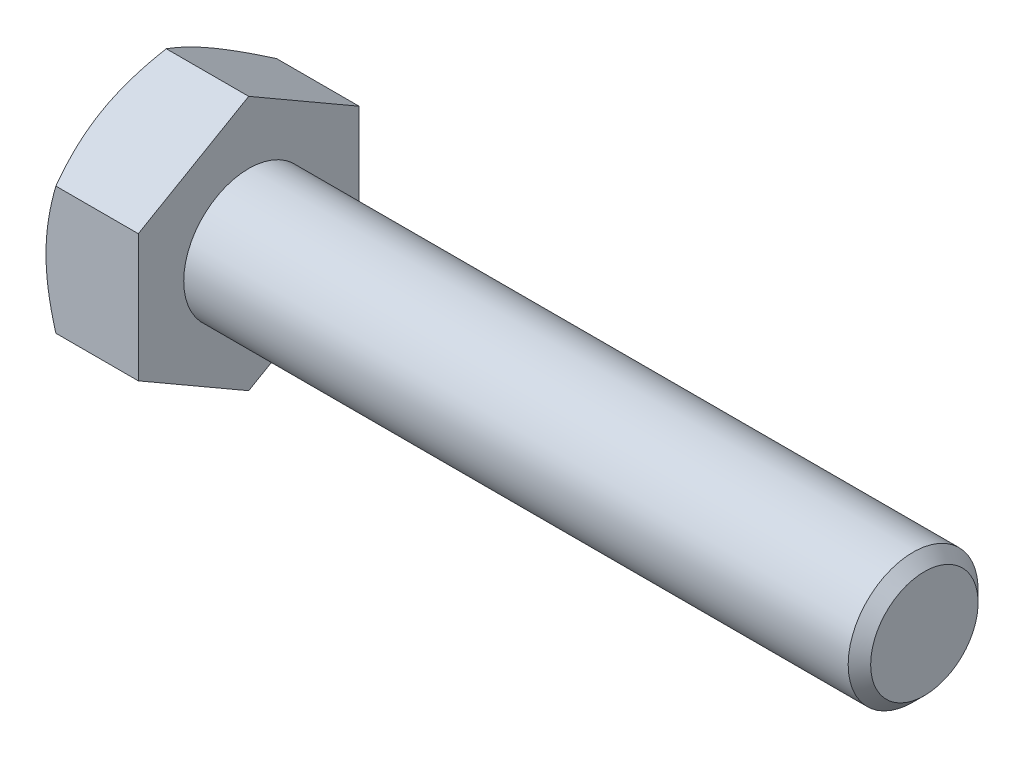
ISO-10303-21;
HEADER;
FILE_DESCRIPTION(('STEP AP214'),'2;1');
FILE_NAME('part.step','',(''),(''),'','','');
FILE_SCHEMA(('AUTOMOTIVE_DESIGN { 1 0 10303 214 1 1 1 1 }'));
ENDSEC;
DATA;
#1=APPLICATION_CONTEXT('core data for automotive mechanical design processes');
#2=APPLICATION_PROTOCOL_DEFINITION('international standard','automotive_design',2000,#1);
#3=PRODUCT_CONTEXT('',#1,'mechanical');
#4=PRODUCT('Part','Part','',(#3));
#5=PRODUCT_RELATED_PRODUCT_CATEGORY('part','',(#4));
#6=PRODUCT_DEFINITION_FORMATION('','',#4);
#7=PRODUCT_DEFINITION_CONTEXT('part definition',#1,'design');
#8=PRODUCT_DEFINITION('design','',#6,#7);
#9=PRODUCT_DEFINITION_SHAPE('','',#8);
#10=(LENGTH_UNIT() NAMED_UNIT(*) SI_UNIT(.MILLI.,.METRE.));
#11=(NAMED_UNIT(*) PLANE_ANGLE_UNIT() SI_UNIT($,.RADIAN.));
#12=(NAMED_UNIT(*) SI_UNIT($,.STERADIAN.) SOLID_ANGLE_UNIT());
#13=UNCERTAINTY_MEASURE_WITH_UNIT(LENGTH_MEASURE(1.E-05),#10,'distance_accuracy_value','');
#14=(GEOMETRIC_REPRESENTATION_CONTEXT(3) GLOBAL_UNCERTAINTY_ASSIGNED_CONTEXT((#13)) GLOBAL_UNIT_ASSIGNED_CONTEXT((#10,
#11,#12)) REPRESENTATION_CONTEXT('',''));
#15=CARTESIAN_POINT('',(0.,0.,0.));
#16=DIRECTION('',(0.,0.,1.));
#17=DIRECTION('',(1.,0.,0.));
#18=AXIS2_PLACEMENT_3D('',#15,#16,#17);
#19=CARTESIAN_POINT('',(11.2776,7.78695402066815,-13.4874));
#20=DIRECTION('',(0.,-0.866025403784438,0.500000000000001));
#21=DIRECTION('',(0.,-0.500000000000001,-0.866025403784438));
#22=AXIS2_PLACEMENT_3D('',#19,#20,#21);
#23=PLANE('',#22);
#24=CARTESIAN_POINT('',(1.20471264673993,15.5740235113902,0.000199999999999582));
#25=CARTESIAN_POINT('',(1.10590292123468,15.4028692246175,-0.296247920623444));
#26=CARTESIAN_POINT('',(1.01157697544227,15.2310473440943,-0.593852147541627));
#27=CARTESIAN_POINT('',(0.833138983730983,14.8860257724644,-1.19144703931188));
#28=CARTESIAN_POINT('',(0.749030297139716,14.7128256480417,-1.49143845468927));
#29=CARTESIAN_POINT('',(0.592157413557192,14.3647128557193,-2.09438749775631));
#30=CARTESIAN_POINT('',(0.51942005806566,14.1897971415685,-2.39735040170777));
#31=CARTESIAN_POINT('',(0.38685172011164,13.8387502572329,-3.00538144121574));
#32=CARTESIAN_POINT('',(0.327020001354858,13.6626191569806,-3.31044945564581));
#33=CARTESIAN_POINT('',(0.222807788341058,13.313654660846,-3.91487369298854));
#34=CARTESIAN_POINT('',(0.178082371198204,13.1408471725831,-4.21418504258819));
#35=CARTESIAN_POINT('',(0.103087648051446,12.794440353521,-4.81417925329214));
#36=CARTESIAN_POINT('',(0.0728186202980918,12.6208410075453,-5.11486214068277));
#37=CARTESIAN_POINT('',(0.0275009516884585,12.2733506882642,-5.71673302881592));
#38=CARTESIAN_POINT('',(0.0124342242129559,12.0994603086309,-6.0179200012882));
#39=CARTESIAN_POINT('',(-0.00215482226567055,11.7515190260032,-6.62057198085018));
#40=CARTESIAN_POINT('',(-0.00167762156738058,11.5774681281348,-6.9220369790612));
#41=CARTESIAN_POINT('',(0.0137354960980475,11.2520805117557,-7.48562486278348));
#42=CARTESIAN_POINT('',(0.0267913834058012,11.1007206061918,-7.74778790944904));
#43=CARTESIAN_POINT('',(0.0644123875667279,10.7983489571605,-8.27151096833966));
#44=CARTESIAN_POINT('',(0.0889783185108697,10.6473372390793,-8.53307093659454));
#45=CARTESIAN_POINT('',(0.149191083844901,10.3457439897813,-9.05544576759836));
#46=CARTESIAN_POINT('',(0.184847070217926,10.1951629179108,-9.31625983473626));
#47=CARTESIAN_POINT('',(0.266614364732165,9.89470672888655,-9.83666521957483));
#48=CARTESIAN_POINT('',(0.312726383654766,9.74483166043291,-10.0962564529244));
#49=CARTESIAN_POINT('',(0.467912143386673,9.2898775346353,-10.8842601139189));
#50=CARTESIAN_POINT('',(0.592459573008814,8.98611595538875,-11.4103906025613));
#51=CARTESIAN_POINT('',(0.875131353524433,8.38312227361395,-12.4548062960383));
#52=CARTESIAN_POINT('',(1.0331893172288,8.08388245064316,-12.9731048730716));
#53=CARTESIAN_POINT('',(1.20471264673992,7.78683855061431,-13.4876));
#54=B_SPLINE_CURVE_WITH_KNOTS('',3,(#24,#25,#26,#27,#28,#29,#30,#31,#32,#33,#34,#35,#36,#37,#38,
#39,#40,#41,#42,#43,#44,#45,#46,#47,#48,#49,#50,#51,#52,#53),.UNSPECIFIED.,.F.,.F.,(4,2,2,2,2,2,
2,2,2,2,2,2,2,2,4),(0.,1.06888094682568,2.13811238471378,3.20983077891486,4.28148801309774,
5.32669414783996,6.37192039946302,7.4159016434827,8.4598506291032,9.368635201441,
10.2774840606786,11.1870849394316,12.0967476696849,13.9560764321537,15.811755563385),.UNSPECIFIED.);
#55=CARTESIAN_POINT('',(1.20464597933184,15.5739080413363,0.));
#56=VERTEX_POINT('',#55);
#57=CARTESIAN_POINT('',(0.,11.6804310310022,-6.74370000000001));
#58=VERTEX_POINT('',#57);
#59=EDGE_CURVE('E53',#56,#58,#54,.T.);
#60=ORIENTED_EDGE('',*,*,#59,.F.);
#61=DIRECTION('',(-1.,0.,0.));
#62=VECTOR('',#61,1.);
#63=CARTESIAN_POINT('',(11.2776,15.5739080413363,0.));
#64=LINE('',#63,#62);
#65=CARTESIAN_POINT('',(11.2776,15.5739080413363,0.));
#66=VERTEX_POINT('',#65);
#67=EDGE_CURVE('E149',#66,#56,#64,.T.);
#68=ORIENTED_EDGE('',*,*,#67,.F.);
#69=DIRECTION('',(0.,0.500000000000001,0.866025403784438));
#70=VECTOR('',#69,1.);
#71=CARTESIAN_POINT('',(11.2776,7.78695402066815,-13.4874));
#72=LINE('',#71,#70);
#73=CARTESIAN_POINT('',(11.2776,7.78695402066815,-13.4874));
#74=VERTEX_POINT('',#73);
#75=EDGE_CURVE('E240',#74,#66,#72,.T.);
#76=ORIENTED_EDGE('',*,*,#75,.F.);
#77=DIRECTION('',(-1.,0.,0.));
#78=VECTOR('',#77,1.);
#79=CARTESIAN_POINT('',(11.2776,7.78695402066815,-13.4874));
#80=LINE('',#79,#78);
#81=CARTESIAN_POINT('',(1.20464597933183,7.78695402066815,-13.4874));
#82=VERTEX_POINT('',#81);
#83=EDGE_CURVE('E137',#74,#82,#80,.T.);
#84=ORIENTED_EDGE('',*,*,#83,.T.);
#85=EDGE_CURVE('E131',#58,#82,#54,.T.);
#86=ORIENTED_EDGE('',*,*,#85,.F.);
#87=EDGE_LOOP('',(#60,#68,#76,#84,#86));
#88=FACE_BOUND('',#87,.T.);
#89=ADVANCED_FACE('F37',(#88),#23,.F.);
#90=CARTESIAN_POINT('',(11.2776,15.5739080413363,0.));
#91=DIRECTION('',(0.,-0.866025403784438,-0.500000000000001));
#92=DIRECTION('',(0.,0.500000000000001,-0.866025403784438));
#93=AXIS2_PLACEMENT_3D('',#90,#91,#92);
#94=PLANE('',#93);
#95=CARTESIAN_POINT('',(1.20471264673993,7.78683855061431,13.4876));
#96=CARTESIAN_POINT('',(1.10590292123467,7.95799283738696,13.1911520793766));
#97=CARTESIAN_POINT('',(1.01157697544226,8.12981471791015,12.8935478524584));
#98=CARTESIAN_POINT('',(0.833138983730976,8.47483628954005,12.2959529606881));
#99=CARTESIAN_POINT('',(0.749030297139708,8.64803641396276,11.9959615453107));
#100=CARTESIAN_POINT('',(0.592157413557186,8.99614920628514,11.3930125022437));
#101=CARTESIAN_POINT('',(0.519420058065655,9.17106492043599,11.0900495982922));
#102=CARTESIAN_POINT('',(0.386851720111636,9.52211180477157,10.4820185587843));
#103=CARTESIAN_POINT('',(0.327020001354854,9.69824290502391,10.1769505443542));
#104=CARTESIAN_POINT('',(0.222807788341055,10.0472074011585,9.57252630701147));
#105=CARTESIAN_POINT('',(0.178082371198202,10.2200148894213,9.27321495741181));
#106=CARTESIAN_POINT('',(0.103087648051445,10.5664217084835,8.67322074670786));
#107=CARTESIAN_POINT('',(0.0728186202980906,10.7400210544592,8.37253785931723));
#108=CARTESIAN_POINT('',(0.0275009516884577,11.0875113737403,7.77066697118409));
#109=CARTESIAN_POINT('',(0.0124342242129552,11.2614017533735,7.4694799987118));
#110=CARTESIAN_POINT('',(-0.00215482226566931,11.6093430360013,6.86682801914982));
#111=CARTESIAN_POINT('',(-0.00167762156737742,11.7833939338697,6.5653630209388));
#112=CARTESIAN_POINT('',(0.0137354960980513,12.1087815502488,6.00177513721653));
#113=CARTESIAN_POINT('',(0.0267913834058043,12.2601414558127,5.73961209055097));
#114=CARTESIAN_POINT('',(0.0644123875667306,12.562513104844,5.21588903166034));
#115=CARTESIAN_POINT('',(0.0889783185108728,12.7135248229252,4.95432906340547));
#116=CARTESIAN_POINT('',(0.149191083844905,13.0151180722231,4.43195423240164));
#117=CARTESIAN_POINT('',(0.18484707021793,13.1656991440936,4.17114016526374));
#118=CARTESIAN_POINT('',(0.26661436473217,13.4661553331179,3.65073478042517));
#119=CARTESIAN_POINT('',(0.312726383654772,13.6160304015716,3.3911435470756));
#120=CARTESIAN_POINT('',(0.46791214338668,14.0709845273692,2.60313988608106));
#121=CARTESIAN_POINT('',(0.592459573008822,14.3747461066157,2.07700939743867));
#122=CARTESIAN_POINT('',(0.875131353524442,14.9777397883905,1.0325937039617));
#123=CARTESIAN_POINT('',(1.0331893172288,15.2769796113613,0.514295126928374));
#124=CARTESIAN_POINT('',(1.20471264673993,15.5740235113902,-0.000199999999999983));
#125=B_SPLINE_CURVE_WITH_KNOTS('',3,(#95,#96,#97,#98,#99,#100,#101,#102,#103,#104,#105,#106,
#107,#108,#109,#110,#111,#112,#113,#114,#115,#116,#117,#118,#119,#120,#121,#122,#123,#124),
.UNSPECIFIED.,.F.,.F.,(4,2,2,2,2,2,2,2,2,2,2,2,2,2,4),(0.,1.06888094682568,2.13811238471378,
3.20983077891486,4.28148801309774,5.32669414783995,6.37192039946301,7.41590164348269,
8.4598506291032,9.36863520144099,10.2774840606786,11.1870849394316,12.0967476696849,
13.9560764321537,15.811755563385),.UNSPECIFIED.);
#126=CARTESIAN_POINT('',(1.20464597933183,7.78695402066815,13.4874));
#127=VERTEX_POINT('',#126);
#128=CARTESIAN_POINT('',(0.,11.6804310310022,6.74370000000001));
#129=VERTEX_POINT('',#128);
#130=EDGE_CURVE('E60',#127,#129,#125,.T.);
#131=ORIENTED_EDGE('',*,*,#130,.F.);
#132=DIRECTION('',(-1.,0.,0.));
#133=VECTOR('',#132,1.);
#134=CARTESIAN_POINT('',(11.2776,7.78695402066815,13.4874));
#135=LINE('',#134,#133);
#136=CARTESIAN_POINT('',(11.2776,7.78695402066815,13.4874));
#137=VERTEX_POINT('',#136);
#138=EDGE_CURVE('E147',#137,#127,#135,.T.);
#139=ORIENTED_EDGE('',*,*,#138,.F.);
#140=DIRECTION('',(0.,-0.500000000000001,0.866025403784438));
#141=VECTOR('',#140,1.);
#142=CARTESIAN_POINT('',(11.2776,15.5739080413363,0.));
#143=LINE('',#142,#141);
#144=EDGE_CURVE('E238',#66,#137,#143,.T.);
#145=ORIENTED_EDGE('',*,*,#144,.F.);
#146=ORIENTED_EDGE('',*,*,#67,.T.);
#147=EDGE_CURVE('E164',#129,#56,#125,.T.);
#148=ORIENTED_EDGE('',*,*,#147,.F.);
#149=EDGE_LOOP('',(#131,#139,#145,#146,#148));
#150=FACE_BOUND('',#149,.T.);
#151=ADVANCED_FACE('F170',(#150),#94,.F.);
#152=CARTESIAN_POINT('',(11.2776,7.78695402066815,13.4874));
#153=DIRECTION('',(0.,0.,-1.));
#154=DIRECTION('',(-1.,0.,0.));
#155=AXIS2_PLACEMENT_3D('',#152,#153,#154);
#156=PLANE('',#155);
#157=CARTESIAN_POINT('',(6.70289567110901,-21.1650011460167,13.4874));
#158=CARTESIAN_POINT('',(6.55897882420083,-20.8694131098093,13.4874));
#159=CARTESIAN_POINT('',(6.41576105782704,-20.5734848616067,13.4874));
#160=CARTESIAN_POINT('',(6.13088153453249,-19.9808770343434,13.4874));
#161=CARTESIAN_POINT('',(5.98921979251738,-19.6841974481188,13.4874));
#162=CARTESIAN_POINT('',(5.56676961746989,-18.7928496773901,13.4874));
#163=CARTESIAN_POINT('',(5.28855708501329,-18.1969561570232,13.4874));
#164=CARTESIAN_POINT('',(4.73919155772155,-16.9981378757298,13.4874));
#165=CARTESIAN_POINT('',(4.46808314591332,-16.3951926367063,13.4874));
#166=CARTESIAN_POINT('',(3.9366293310848,-15.1845934749592,13.4874));
#167=CARTESIAN_POINT('',(3.67628343580331,-14.5769397691067,13.4874));
#168=CARTESIAN_POINT('',(3.16064854718106,-13.3353806523822,13.4874));
#169=CARTESIAN_POINT('',(2.90582565865237,-12.7012806750375,13.4874));
#170=CARTESIAN_POINT('',(2.41487039511458,-11.4257499308222,13.4874));
#171=CARTESIAN_POINT('',(2.17874008282491,-10.7843183638259,13.4874));
#172=CARTESIAN_POINT('',(1.73119169838206,-9.49424688182772,13.4874));
#173=CARTESIAN_POINT('',(1.51972566234566,-8.8456237373687,13.4874));
#174=CARTESIAN_POINT('',(1.12811373334564,-7.53901553680717,13.4874));
#175=CARTESIAN_POINT('',(0.947958233680589,-6.88103341949477,13.4874));
#176=CARTESIAN_POINT('',(0.708100926721024,-5.88874746863111,13.4874));
#177=CARTESIAN_POINT('',(0.633381885453708,-5.55805325553757,13.4874));
#178=CARTESIAN_POINT('',(0.494933342558831,-4.89436040722769,13.4874));
#179=CARTESIAN_POINT('',(0.431203627655067,-4.56136181686422,13.4874));
#180=CARTESIAN_POINT('',(0.315842689047359,-3.89327115028416,13.4874));
#181=CARTESIAN_POINT('',(0.264211246265808,-3.55817911208892,13.4874));
#182=CARTESIAN_POINT('',(0.174067184363883,-2.88623799123086,13.4874));
#183=CARTESIAN_POINT('',(0.135553978986036,-2.54938898777054,13.4874));
#184=CARTESIAN_POINT('',(0.0729081917491167,-1.8789079692466,13.4874));
#185=CARTESIAN_POINT('',(0.0485895630452332,-1.54529344529535,13.4874));
#186=CARTESIAN_POINT('',(0.0140936953875874,-0.877334753257613,13.4874));
#187=CARTESIAN_POINT('',(0.00391621478539878,-0.542990597737098,13.4874));
#188=CARTESIAN_POINT('',(-0.00205398162992253,0.125828888759139,13.4874));
#189=CARTESIAN_POINT('',(0.00215329089649117,0.460304219628309,13.4874));
#190=CARTESIAN_POINT('',(0.0248467834538898,1.12877320703551,13.4874));
#191=CARTESIAN_POINT('',(0.0433336380154095,1.462766841508,13.4874));
#192=CARTESIAN_POINT('',(0.103957920963044,2.25806301438129,13.4874));
#193=CARTESIAN_POINT('',(0.152459292642797,2.7188913808826,13.4874));
#194=CARTESIAN_POINT('',(0.274055458410876,3.63726733621982,13.4874));
#195=CARTESIAN_POINT('',(0.347153391946035,4.09481449863288,13.4874));
#196=CARTESIAN_POINT('',(0.599477852560546,5.46193438681152,13.4874));
#197=CARTESIAN_POINT('',(0.811693587459027,6.36550685182964,13.4874));
#198=CARTESIAN_POINT('',(1.18147428848563,7.7168988616068,13.4874));
#199=CARTESIAN_POINT('',(1.31507608235492,8.17168027844059,13.4874));
#200=CARTESIAN_POINT('',(1.5966046388761,9.07683098072689,13.4874));
#201=CARTESIAN_POINT('',(1.74453150078872,9.52720023558299,13.4874));
#202=CARTESIAN_POINT('',(2.05229982617036,10.4236592938426,13.4874));
#203=CARTESIAN_POINT('',(2.21213768863264,10.8697503449942,13.4874));
#204=CARTESIAN_POINT('',(2.54180286188869,11.7582069223146,13.4874));
#205=CARTESIAN_POINT('',(2.71163002533319,12.2005725033266,13.4874));
#206=CARTESIAN_POINT('',(3.13997482022977,13.2855075061871,13.4874));
#207=CARTESIAN_POINT('',(3.40323541651347,13.9262014359075,13.4874));
#208=CARTESIAN_POINT('',(3.94357290850478,15.2017556015035,13.4874));
#209=CARTESIAN_POINT('',(4.22065084854956,15.8366153921178,13.4874));
#210=CARTESIAN_POINT('',(4.78571477781993,17.1016560512798,13.4874));
#211=CARTESIAN_POINT('',(5.07370373250181,17.7318355913306,13.4874));
#212=CARTESIAN_POINT('',(5.6582709376612,18.9881665962922,13.4874));
#213=CARTESIAN_POINT('',(5.95484895914456,19.6143181680502,13.4874));
#214=CARTESIAN_POINT('',(6.55529098073026,20.8640886439908,13.4874));
#215=CARTESIAN_POINT('',(6.85916373799559,21.487703332918,13.4874));
#216=CARTESIAN_POINT('',(7.47253580273156,22.7321593932013,13.4874));
#217=CARTESIAN_POINT('',(7.78203514040859,23.3530007496463,13.4874));
#218=CARTESIAN_POINT('',(8.40560448696871,24.5922586187533,13.4874));
#219=CARTESIAN_POINT('',(8.71967376781928,25.2106754981538,13.4874));
#220=CARTESIAN_POINT('',(9.35165086063897,26.4455459003651,13.4874));
#221=CARTESIAN_POINT('',(9.66955868838178,27.0619994150947,13.4874));
#222=CARTESIAN_POINT('',(10.5703283480072,28.7975880261079,13.4874));
#223=CARTESIAN_POINT('',(11.1568860284919,29.9148048217173,13.4874));
#224=CARTESIAN_POINT('',(12.337846772962,32.1451360163921,13.4874));
#225=CARTESIAN_POINT('',(12.9322501754984,33.2582502357585,13.4874));
#226=CARTESIAN_POINT('',(14.1253307037013,35.4781426665254,13.4874));
#227=CARTESIAN_POINT('',(14.7239910663369,36.5849298934138,13.4874));
#228=CARTESIAN_POINT('',(15.625417956536,38.2431956931505,13.4874));
#229=CARTESIAN_POINT('',(15.9264569466041,38.795614729406,13.4874));
#230=CARTESIAN_POINT('',(16.5295640603066,39.8998897044512,13.4874));
#231=CARTESIAN_POINT('',(16.8316321823926,40.4517456440866,13.4874));
#232=CARTESIAN_POINT('',(17.1341541394821,41.0033527535217,13.4874));
#233=B_SPLINE_CURVE_WITH_KNOTS('',3,(#157,#158,#159,#160,#161,#162,#163,#164,#165,#166,#167,
#168,#169,#170,#171,#172,#173,#174,#175,#176,#177,#178,#179,#180,#181,#182,#183,#184,#185,#186,
#187,#188,#189,#190,#191,#192,#193,#194,#195,#196,#197,#198,#199,#200,#201,#202,#203,#204,#205,
#206,#207,#208,#209,#210,#211,#212,#213,#214,#215,#216,#217,#218,#219,#220,#221,#222,#223,#224,
#225,#226,#227,#228,#229,#230,#231,#232),.UNSPECIFIED.,.F.,.F.,(4,2,2,2,2,2,2,2,2,2,2,2,2,2,2,2,
2,2,2,2,2,2,2,2,2,2,2,2,2,2,2,2,2,2,2,2,2,4),(0.,0.986283805121444,1.97257704994349,
3.94544286935061,5.9286370113506,7.91174034446846,9.96167557472267,12.0118367002139,
14.0579420096359,16.103418420291,17.1203565303706,18.1372749019233,19.1541748575187,
20.1710293616237,21.1742380617423,22.1774296185014,23.1806203620616,24.1838556861831,
25.5731966840952,26.9627150815065,29.7431867200321,31.1650601311074,32.5869433952803,
34.0083985174925,35.4298326774873,37.5076242640023,39.5855731320869,41.6640908660621,
43.7425532353441,45.8236496276477,47.90475719566,49.9855367777957,52.0663249133592,
55.8517771330206,59.6373932363266,63.4123417474898,65.2996992534978,67.1870539207399),.UNSPECIFIED.);
#234=CARTESIAN_POINT('',(1.20464597933183,-7.78695402066814,13.4874));
#235=VERTEX_POINT('',#234);
#236=CARTESIAN_POINT('',(0.,0.,13.4874));
#237=VERTEX_POINT('',#236);
#238=EDGE_CURVE('E250',#235,#237,#233,.T.);
#239=ORIENTED_EDGE('',*,*,#238,.F.);
#240=DIRECTION('',(-1.,0.,0.));
#241=VECTOR('',#240,1.);
#242=CARTESIAN_POINT('',(11.2776,-7.78695402066814,13.4874));
#243=LINE('',#242,#241);
#244=CARTESIAN_POINT('',(11.2776,-7.78695402066814,13.4874));
#245=VERTEX_POINT('',#244);
#246=EDGE_CURVE('E139',#245,#235,#243,.T.);
#247=ORIENTED_EDGE('',*,*,#246,.F.);
#248=DIRECTION('',(0.,-1.,0.));
#249=VECTOR('',#248,1.);
#250=CARTESIAN_POINT('',(11.2776,7.78695402066815,13.4874));
#251=LINE('',#250,#249);
#252=EDGE_CURVE('E234',#137,#245,#251,.T.);
#253=ORIENTED_EDGE('',*,*,#252,.F.);
#254=ORIENTED_EDGE('',*,*,#138,.T.);
#255=EDGE_CURVE('E188',#237,#127,#233,.T.);
#256=ORIENTED_EDGE('',*,*,#255,.F.);
#257=EDGE_LOOP('',(#239,#247,#253,#254,#256));
#258=FACE_BOUND('',#257,.T.);
#259=ADVANCED_FACE('F256',(#258),#156,.F.);
#260=CARTESIAN_POINT('',(11.2776,-15.5739080413363,0.));
#261=DIRECTION('',(0.,0.866025403784438,-0.500000000000002));
#262=DIRECTION('',(0.,0.500000000000002,0.866025403784438));
#263=AXIS2_PLACEMENT_3D('',#260,#261,#262);
#264=PLANE('',#263);
#265=CARTESIAN_POINT('',(1.20471264673994,-15.5740235113902,-0.000200000000000067));
#266=CARTESIAN_POINT('',(1.10590292123468,-15.4028692246175,0.296247920623443));
#267=CARTESIAN_POINT('',(1.01157697544227,-15.2310473440943,0.593852147541626));
#268=CARTESIAN_POINT('',(0.833138983730989,-14.8860257724644,1.19144703931188));
#269=CARTESIAN_POINT('',(0.749030297139722,-14.7128256480417,1.49143845468927));
#270=CARTESIAN_POINT('',(0.592157413557198,-14.3647128557193,2.09438749775631));
#271=CARTESIAN_POINT('',(0.519420058065666,-14.1897971415685,2.39735040170777));
#272=CARTESIAN_POINT('',(0.386851720111645,-13.8387502572329,3.00538144121574));
#273=CARTESIAN_POINT('',(0.327020001354862,-13.6626191569806,3.31044945564582));
#274=CARTESIAN_POINT('',(0.222807788341062,-13.313654660846,3.91487369298854));
#275=CARTESIAN_POINT('',(0.178082371198208,-13.1408471725831,4.2141850425882));
#276=CARTESIAN_POINT('',(0.103087648051449,-12.794440353521,4.81417925329215));
#277=CARTESIAN_POINT('',(0.0728186202980949,-12.6208410075453,5.11486214068278));
#278=CARTESIAN_POINT('',(0.0275009516884614,-12.2733506882642,5.71673302881592));
#279=CARTESIAN_POINT('',(0.0124342242129589,-12.0994603086309,6.0179200012882));
#280=CARTESIAN_POINT('',(-0.00215482226566748,-11.7515190260032,6.62057198085018));
#281=CARTESIAN_POINT('',(-0.00167762156737732,-11.5774681281348,6.92203697906121));
#282=CARTESIAN_POINT('',(0.0137354960980507,-11.2520805117557,7.48562486278348));
#283=CARTESIAN_POINT('',(0.0267913834058044,-11.1007206061918,7.74778790944904));
#284=CARTESIAN_POINT('',(0.0644123875667303,-10.7983489571605,8.27151096833967));
#285=CARTESIAN_POINT('',(0.0889783185108715,-10.6473372390793,8.53307093659454));
#286=CARTESIAN_POINT('',(0.149191083844902,-10.3457439897813,9.05544576759836));
#287=CARTESIAN_POINT('',(0.184847070217927,-10.1951629179108,9.31625983473627));
#288=CARTESIAN_POINT('',(0.266614364732166,-9.89470672888655,9.83666521957483));
#289=CARTESIAN_POINT('',(0.312726383654767,-9.74483166043291,10.0962564529244));
#290=CARTESIAN_POINT('',(0.467912143386673,-9.2898775346353,10.8842601139189));
#291=CARTESIAN_POINT('',(0.592459573008814,-8.98611595538874,11.4103906025613));
#292=CARTESIAN_POINT('',(0.875131353524433,-8.38312227361395,12.4548062960383));
#293=CARTESIAN_POINT('',(1.0331893172288,-8.08388245064316,12.9731048730716));
#294=CARTESIAN_POINT('',(1.20471264673992,-7.7868385506143,13.4876));
#295=B_SPLINE_CURVE_WITH_KNOTS('',3,(#265,#266,#267,#268,#269,#270,#271,#272,#273,#274,#275,
#276,#277,#278,#279,#280,#281,#282,#283,#284,#285,#286,#287,#288,#289,#290,#291,#292,#293,#294),
.UNSPECIFIED.,.F.,.F.,(4,2,2,2,2,2,2,2,2,2,2,2,2,2,4),(0.,1.06888094682568,2.13811238471378,
3.20983077891486,4.28148801309775,5.32669414783996,6.37192039946303,7.41590164348271,
8.45985062910322,9.36863520144101,10.2774840606786,11.1870849394316,12.0967476696849,
13.9560764321538,15.811755563385),.UNSPECIFIED.);
#296=CARTESIAN_POINT('',(1.20464597933185,-15.5739080413363,0.));
#297=VERTEX_POINT('',#296);
#298=CARTESIAN_POINT('',(0.,-11.6804310310022,6.74370000000003));
#299=VERTEX_POINT('',#298);
#300=EDGE_CURVE('E172',#297,#299,#295,.T.);
#301=ORIENTED_EDGE('',*,*,#300,.F.);
#302=DIRECTION('',(-1.,0.,0.));
#303=VECTOR('',#302,1.);
#304=CARTESIAN_POINT('',(11.2776,-15.5739080413363,0.));
#305=LINE('',#304,#303);
#306=CARTESIAN_POINT('',(11.2776,-15.5739080413363,0.));
#307=VERTEX_POINT('',#306);
#308=EDGE_CURVE('E136',#307,#297,#305,.T.);
#309=ORIENTED_EDGE('',*,*,#308,.F.);
#310=DIRECTION('',(0.,-0.500000000000002,-0.866025403784437));
#311=VECTOR('',#310,1.);
#312=CARTESIAN_POINT('',(11.2776,-15.5739080413363,0.));
#313=LINE('',#312,#311);
#314=EDGE_CURVE('E232',#245,#307,#313,.T.);
#315=ORIENTED_EDGE('',*,*,#314,.F.);
#316=ORIENTED_EDGE('',*,*,#246,.T.);
#317=EDGE_CURVE('E174',#299,#235,#295,.T.);
#318=ORIENTED_EDGE('',*,*,#317,.F.);
#319=EDGE_LOOP('',(#301,#309,#315,#316,#318));
#320=FACE_BOUND('',#319,.T.);
#321=ADVANCED_FACE('F228',(#320),#264,.F.);
#322=CARTESIAN_POINT('',(11.2776,-7.78695402066817,-13.4874));
#323=DIRECTION('',(0.,0.866025403784438,0.5));
#324=DIRECTION('',(0.,-0.5,0.866025403784438));
#325=AXIS2_PLACEMENT_3D('',#322,#323,#324);
#326=PLANE('',#325);
#327=CARTESIAN_POINT('',(1.20471264673993,-7.78683855061434,-13.4876));
#328=CARTESIAN_POINT('',(1.10590292123467,-7.95799283738699,-13.1911520793766));
#329=CARTESIAN_POINT('',(1.01157697544227,-8.12981471791017,-12.8935478524584));
#330=CARTESIAN_POINT('',(0.833138983730984,-8.47483628954007,-12.2959529606881));
#331=CARTESIAN_POINT('',(0.749030297139717,-8.64803641396279,-11.9959615453107));
#332=CARTESIAN_POINT('',(0.592157413557195,-8.99614920628516,-11.3930125022437));
#333=CARTESIAN_POINT('',(0.519420058065664,-9.17106492043601,-11.0900495982922));
#334=CARTESIAN_POINT('',(0.386851720111645,-9.52211180477159,-10.4820185587843));
#335=CARTESIAN_POINT('',(0.327020001354863,-9.69824290502394,-10.1769505443542));
#336=CARTESIAN_POINT('',(0.222807788341064,-10.0472074011585,-9.57252630701146));
#337=CARTESIAN_POINT('',(0.178082371198211,-10.2200148894214,-9.2732149574118));
#338=CARTESIAN_POINT('',(0.103087648051453,-10.5664217084835,-8.67322074670785));
#339=CARTESIAN_POINT('',(0.0728186202980982,-10.7400210544592,-8.37253785931722));
#340=CARTESIAN_POINT('',(0.0275009516884661,-11.0875113737403,-7.77066697118408));
#341=CARTESIAN_POINT('',(0.0124342242129652,-11.2614017533736,-7.4694799987118));
#342=CARTESIAN_POINT('',(-0.00215482226565931,-11.6093430360013,-6.86682801914982));
#343=CARTESIAN_POINT('',(-0.001677621567369,-11.7833939338697,-6.56536302093879));
#344=CARTESIAN_POINT('',(0.0137354960980598,-12.1087815502488,-6.00177513721652));
#345=CARTESIAN_POINT('',(0.0267913834058141,-12.2601414558127,-5.73961209055096));
#346=CARTESIAN_POINT('',(0.0644123875667407,-12.562513104844,-5.21588903166034));
#347=CARTESIAN_POINT('',(0.0889783185108819,-12.7135248229252,-4.95432906340546));
#348=CARTESIAN_POINT('',(0.149191083844914,-13.0151180722231,-4.43195423240164));
#349=CARTESIAN_POINT('',(0.18484707021794,-13.1656991440937,-4.17114016526373));
#350=CARTESIAN_POINT('',(0.26661436473218,-13.4661553331179,-3.65073478042517));
#351=CARTESIAN_POINT('',(0.312726383654781,-13.6160304015716,-3.39114354707559));
#352=CARTESIAN_POINT('',(0.467912143386688,-14.0709845273692,-2.60313988608105));
#353=CARTESIAN_POINT('',(0.59245957300883,-14.3747461066157,-2.07700939743866));
#354=CARTESIAN_POINT('',(0.87513135352445,-14.9777397883905,-1.0325937039617));
#355=CARTESIAN_POINT('',(1.03318931722881,-15.2769796113613,-0.514295126928376));
#356=CARTESIAN_POINT('',(1.20471264673994,-15.5740235113902,0.000199999999999012));
#357=B_SPLINE_CURVE_WITH_KNOTS('',3,(#327,#328,#329,#330,#331,#332,#333,#334,#335,#336,#337,
#338,#339,#340,#341,#342,#343,#344,#345,#346,#347,#348,#349,#350,#351,#352,#353,#354,#355,#356),
.UNSPECIFIED.,.F.,.F.,(4,2,2,2,2,2,2,2,2,2,2,2,2,2,4),(0.,1.06888094682568,2.13811238471378,
3.20983077891485,4.28148801309774,5.32669414783995,6.37192039946302,7.4159016434827,
8.4598506291032,9.368635201441,10.2774840606786,11.1870849394316,12.0967476696849,
13.9560764321537,15.811755563385),.UNSPECIFIED.);
#358=CARTESIAN_POINT('',(1.20464597933184,-7.78695402066817,-13.4874));
#359=VERTEX_POINT('',#358);
#360=CARTESIAN_POINT('',(0.,-11.6804310310022,-6.7437));
#361=VERTEX_POINT('',#360);
#362=EDGE_CURVE('E113',#359,#361,#357,.T.);
#363=ORIENTED_EDGE('',*,*,#362,.F.);
#364=DIRECTION('',(-1.,0.,0.));
#365=VECTOR('',#364,1.);
#366=CARTESIAN_POINT('',(11.2776,-7.78695402066817,-13.4874));
#367=LINE('',#366,#365);
#368=CARTESIAN_POINT('',(11.2776,-7.78695402066817,-13.4874));
#369=VERTEX_POINT('',#368);
#370=EDGE_CURVE('E127',#369,#359,#367,.T.);
#371=ORIENTED_EDGE('',*,*,#370,.F.);
#372=DIRECTION('',(0.,0.5,-0.866025403784438));
#373=VECTOR('',#372,1.);
#374=CARTESIAN_POINT('',(11.2776,-7.78695402066817,-13.4874));
#375=LINE('',#374,#373);
#376=EDGE_CURVE('E230',#307,#369,#375,.T.);
#377=ORIENTED_EDGE('',*,*,#376,.F.);
#378=ORIENTED_EDGE('',*,*,#308,.T.);
#379=EDGE_CURVE('E130',#361,#297,#357,.T.);
#380=ORIENTED_EDGE('',*,*,#379,.F.);
#381=EDGE_LOOP('',(#363,#371,#377,#378,#380));
#382=FACE_BOUND('',#381,.T.);
#383=ADVANCED_FACE('F125',(#382),#326,.F.);
#384=CARTESIAN_POINT('',(11.2776,7.78695402066815,-13.4874));
#385=DIRECTION('',(0.,0.,1.));
#386=DIRECTION('',(0.,-1.,0.));
#387=AXIS2_PLACEMENT_3D('',#384,#385,#386);
#388=PLANE('',#387);
#389=CARTESIAN_POINT('',(6.70289567470981,-21.1650011534122,-13.4874));
#390=CARTESIAN_POINT('',(6.55897882772656,-20.8694131170804,-13.4874));
#391=CARTESIAN_POINT('',(6.41576106127774,-20.5734848687535,-13.4874));
#392=CARTESIAN_POINT('',(6.13088153783325,-19.9808770412412,-13.4874));
#393=CARTESIAN_POINT('',(5.98921979574324,-19.684197454892,-13.4874));
#394=CARTESIAN_POINT('',(5.56676962047126,-18.7928496837894,-13.4874));
#395=CARTESIAN_POINT('',(5.28855708786537,-18.1969561631728,-13.4874));
#396=CARTESIAN_POINT('',(4.73919156027493,-16.9981378813763,-13.4874));
#397=CARTESIAN_POINT('',(4.46808314831735,-16.3951926420993,-13.4874));
#398=CARTESIAN_POINT('',(3.93662933319256,-15.1845934798436,-13.4874));
#399=CARTESIAN_POINT('',(3.67628343776417,-14.5769397737359,-13.4874));
#400=CARTESIAN_POINT('',(3.16064854884365,-13.3353806564808,-13.4874));
#401=CARTESIAN_POINT('',(2.90582566016393,-12.7012806788605,-13.4874));
#402=CARTESIAN_POINT('',(2.41487039633211,-11.4257499340895,-13.4874));
#403=CARTESIAN_POINT('',(2.17874008389944,-10.7843183668132,-13.4874));
#404=CARTESIAN_POINT('',(1.73119169918421,-9.4942468842498,-13.4874));
#405=CARTESIAN_POINT('',(1.5197256630184,-8.8456237395056,-13.4874));
#406=CARTESIAN_POINT('',(1.12811373378057,-7.53901553836587,-13.4874));
#407=CARTESIAN_POINT('',(0.947958234007098,-6.88103342076045,-13.4874));
#408=CARTESIAN_POINT('',(0.708100926891913,-5.88874746938033,-13.4874));
#409=CARTESIAN_POINT('',(0.633381885567518,-5.55805325606623,-13.4874));
#410=CARTESIAN_POINT('',(0.494933342572901,-4.89436040731206,-13.4874));
#411=CARTESIAN_POINT('',(0.431203627626475,-4.56136181672487,-13.4874));
#412=CARTESIAN_POINT('',(0.315842688950136,-3.89327114969488,-13.4874));
#413=CARTESIAN_POINT('',(0.264211246142605,-3.55817911127344,-13.4874));
#414=CARTESIAN_POINT('',(0.174067184207324,-2.88623798996102,-13.4874));
#415=CARTESIAN_POINT('',(0.135553978822098,-2.54938898627255,-13.4874));
#416=CARTESIAN_POINT('',(0.0729081915906138,-1.87890796729709,-13.4874));
#417=CARTESIAN_POINT('',(0.048589562899172,-1.54529344312249,-13.4874));
#418=CARTESIAN_POINT('',(0.0140936952861677,-0.877334750638472,-13.4874));
#419=CARTESIAN_POINT('',(0.00391621471617855,-0.542990594895021,-13.4874));
#420=CARTESIAN_POINT('',(-0.00205398161541541,0.125828892045461,-13.4874));
#421=CARTESIAN_POINT('',(0.00215329096253039,0.460304223135941,-13.4874));
#422=CARTESIAN_POINT('',(0.0248467836409666,1.12877321098286,-13.4874));
#423=CARTESIAN_POINT('',(0.043333638271992,1.46276684567375,-13.4874));
#424=CARTESIAN_POINT('',(0.103957921390553,2.25806301888338,-13.4874));
#425=CARTESIAN_POINT('',(0.152459293168629,2.71889138550167,-13.4874));
#426=CARTESIAN_POINT('',(0.274055459138601,3.63726734106752,-13.4874));
#427=CARTESIAN_POINT('',(0.347153392777329,4.09481450359224,-13.4874));
#428=CARTESIAN_POINT('',(0.5994778537047,5.46193439209971,-13.4874));
#429=CARTESIAN_POINT('',(0.811693588814485,6.36550685732838,-13.4874));
#430=CARTESIAN_POINT('',(1.18147429015276,7.71689886742034,-13.4874));
#431=CARTESIAN_POINT('',(1.31507608412659,8.17168028436125,-13.4874));
#432=CARTESIAN_POINT('',(1.59660464085364,9.07683098686058,-13.4874));
#433=CARTESIAN_POINT('',(1.74453150286759,9.52720024182259,-13.4874));
#434=CARTESIAN_POINT('',(2.05229982844825,10.4236593002932,-13.4874));
#435=CARTESIAN_POINT('',(2.2121376910082,10.86975035155,-13.4874));
#436=CARTESIAN_POINT('',(2.54180286445619,11.7582069290806,-13.4874));
#437=CARTESIAN_POINT('',(2.71163002799495,12.2005725101978,-13.4874));
#438=CARTESIAN_POINT('',(3.13997482304437,13.2855075131266,-13.4874));
#439=CARTESIAN_POINT('',(3.40323541937957,13.9262014428124,-13.4874));
#440=CARTESIAN_POINT('',(3.94357291146106,15.2017556083434,-13.4874));
#441=CARTESIAN_POINT('',(4.22065085154449,15.8366153989273,-13.4874));
#442=CARTESIAN_POINT('',(4.78571478088249,17.1016560580316,-13.4874));
#443=CARTESIAN_POINT('',(5.07370373559332,17.7318355980551,-13.4874));
#444=CARTESIAN_POINT('',(5.65827094080343,18.9881666029651,-13.4874));
#445=CARTESIAN_POINT('',(5.95484896230855,19.6143181746986,-13.4874));
#446=CARTESIAN_POINT('',(6.55529098393176,20.8640886505915,-13.4874));
#447=CARTESIAN_POINT('',(6.85916374121282,21.4877033394954,-13.4874));
#448=CARTESIAN_POINT('',(7.472535805976,22.7321593997339,-13.4874));
#449=CARTESIAN_POINT('',(7.78203514366454,23.3530007561574,-13.4874));
#450=CARTESIAN_POINT('',(8.40560449024448,24.5922586252231,-13.4874));
#451=CARTESIAN_POINT('',(8.71967377110337,25.2106755046038,-13.4874));
#452=CARTESIAN_POINT('',(9.35165086393713,26.4455459067767,-13.4874));
#453=CARTESIAN_POINT('',(9.66955869168569,27.0619994214877,-13.4874));
#454=CARTESIAN_POINT('',(10.5703283513383,28.7975880324766,-13.4874));
#455=CARTESIAN_POINT('',(11.1568860318423,29.9148048280812,-13.4874));
#456=CARTESIAN_POINT('',(12.337846776347,32.1451360227485,-13.4874));
#457=CARTESIAN_POINT('',(12.9322501788985,33.2582502421122,-13.4874));
#458=CARTESIAN_POINT('',(14.1253307071313,35.47814267288,-13.4874));
#459=CARTESIAN_POINT('',(14.7239910697817,36.5849298997721,-13.4874));
#460=CARTESIAN_POINT('',(15.6254179600016,38.2431956995152,-13.4874));
#461=CARTESIAN_POINT('',(15.9264569500763,38.795614735773,-13.4874));
#462=CARTESIAN_POINT('',(16.5295640637918,39.899889710823,-13.4874));
#463=CARTESIAN_POINT('',(16.8316321858839,40.4517456504609,-13.4874));
#464=CARTESIAN_POINT('',(17.1341541429795,41.0033527598988,-13.4874));
#465=B_SPLINE_CURVE_WITH_KNOTS('',3,(#389,#390,#391,#392,#393,#394,#395,#396,#397,#398,#399,
#400,#401,#402,#403,#404,#405,#406,#407,#408,#409,#410,#411,#412,#413,#414,#415,#416,#417,#418,
#419,#420,#421,#422,#423,#424,#425,#426,#427,#428,#429,#430,#431,#432,#433,#434,#435,#436,#437,
#438,#439,#440,#441,#442,#443,#444,#445,#446,#447,#448,#449,#450,#451,#452,#453,#454,#455,#456,
#457,#458,#459,#460,#461,#462,#463,#464),.UNSPECIFIED.,.F.,.F.,(4,2,2,2,2,2,2,2,2,2,2,2,2,2,2,2,
2,2,2,2,2,2,2,2,2,2,2,2,2,2,2,2,2,2,2,2,2,4),(0.,0.986283805555449,1.9725770508115,
3.94544287108674,5.92863701396401,7.91174034795908,9.96167557914936,12.011836705577,
14.0579420159322,16.1034184275199,17.1203565382825,18.137274910518,19.1541748667954,
20.1710293715823,21.1742380723659,22.17742962979,23.1806203740154,24.1838556988021,
25.5731966970938,26.9627150948848,29.7431867341713,31.1650601456435,32.5869434102133,
34.0083985328214,35.4298326932121,37.5076242796903,39.5855731477378,41.6640908816748,
43.7425532509188,45.8236496431801,47.9047572111501,49.9855367932442,52.0663249287661,
55.8517771484419,59.637393251762,63.4123417629561,65.2996992689798,67.1870539362375),.UNSPECIFIED.);
#466=CARTESIAN_POINT('',(0.,0.,-13.4874));
#467=VERTEX_POINT('',#466);
#468=EDGE_CURVE('E119',#82,#467,#465,.F.);
#469=ORIENTED_EDGE('',*,*,#468,.F.);
#470=ORIENTED_EDGE('',*,*,#83,.F.);
#471=DIRECTION('',(0.,1.,0.));
#472=VECTOR('',#471,1.);
#473=CARTESIAN_POINT('',(11.2776,7.78695402066815,-13.4874));
#474=LINE('',#473,#472);
#475=EDGE_CURVE('E135',#369,#74,#474,.T.);
#476=ORIENTED_EDGE('',*,*,#475,.F.);
#477=ORIENTED_EDGE('',*,*,#370,.T.);
#478=EDGE_CURVE('E110',#467,#359,#465,.F.);
#479=ORIENTED_EDGE('',*,*,#478,.F.);
#480=EDGE_LOOP('',(#469,#470,#476,#477,#479));
#481=FACE_BOUND('',#480,.T.);
#482=ADVANCED_FACE('F133',(#481),#388,.F.);
#483=CARTESIAN_POINT('',(11.2776,15.5739080413363,0.));
#484=DIRECTION('',(1.,0.,0.));
#485=DIRECTION('',(0.,0.,-1.));
#486=AXIS2_PLACEMENT_3D('',#483,#484,#485);
#487=PLANE('',#486);
#488=CARTESIAN_POINT('',(11.2776,0.,0.));
#489=DIRECTION('',(1.,0.,0.));
#490=DIRECTION('',(0.,0.,-1.));
#491=AXIS2_PLACEMENT_3D('',#488,#489,#490);
#492=CIRCLE('',#491,7.9375);
#493=CARTESIAN_POINT('',(11.2776,0.,-7.9375));
#494=VERTEX_POINT('',#493);
#495=EDGE_CURVE('E243',#494,#494,#492,.F.);
#496=ORIENTED_EDGE('',*,*,#495,.T.);
#497=EDGE_LOOP('',(#496));
#498=FACE_BOUND('',#497,.T.);
#499=ORIENTED_EDGE('',*,*,#75,.T.);
#500=ORIENTED_EDGE('',*,*,#144,.T.);
#501=ORIENTED_EDGE('',*,*,#252,.T.);
#502=ORIENTED_EDGE('',*,*,#314,.T.);
#503=ORIENTED_EDGE('',*,*,#376,.T.);
#504=ORIENTED_EDGE('',*,*,#475,.T.);
#505=EDGE_LOOP('',(#499,#500,#501,#502,#503,#504));
#506=FACE_BOUND('',#505,.T.);
#507=ADVANCED_FACE('F258',(#498,#506),#487,.T.);
#508=CARTESIAN_POINT('',(0.,0.,0.));
#509=DIRECTION('',(-1.,0.,0.));
#510=DIRECTION('',(0.,0.,1.));
#511=AXIS2_PLACEMENT_3D('',#508,#509,#510);
#512=CYLINDRICAL_SURFACE('',#511,7.9375);
#513=ORIENTED_EDGE('',*,*,#495,.F.);
#514=EDGE_LOOP('',(#513));
#515=FACE_BOUND('',#514,.T.);
#516=CARTESIAN_POINT('',(92.45346,0.,0.));
#517=DIRECTION('',(-1.,0.,0.));
#518=DIRECTION('',(0.,0.,1.));
#519=AXIS2_PLACEMENT_3D('',#516,#517,#518);
#520=CIRCLE('',#519,7.9375);
#521=CARTESIAN_POINT('',(92.45346,0.,7.9375));
#522=VERTEX_POINT('',#521);
#523=EDGE_CURVE('E246',#522,#522,#520,.T.);
#524=ORIENTED_EDGE('',*,*,#523,.T.);
#525=EDGE_LOOP('',(#524));
#526=FACE_BOUND('',#525,.T.);
#527=ADVANCED_FACE('F289',(#515,#526),#512,.T.);
#528=CARTESIAN_POINT('',(93.8276,0.,0.));
#529=DIRECTION('',(-1.,0.,0.));
#530=DIRECTION('',(0.,0.,1.));
#531=AXIS2_PLACEMENT_3D('',#528,#529,#530);
#532=CONICAL_SURFACE('',#531,6.56336,0.785398163397445);
#533=ORIENTED_EDGE('',*,*,#523,.F.);
#534=EDGE_LOOP('',(#533));
#535=FACE_BOUND('',#534,.T.);
#536=CARTESIAN_POINT('',(93.8276,0.,0.));
#537=DIRECTION('',(-1.,0.,0.));
#538=DIRECTION('',(0.,0.,1.));
#539=AXIS2_PLACEMENT_3D('',#536,#537,#538);
#540=CIRCLE('',#539,6.56336);
#541=CARTESIAN_POINT('',(93.8276,0.,6.56336));
#542=VERTEX_POINT('',#541);
#543=EDGE_CURVE('E248',#542,#542,#540,.T.);
#544=ORIENTED_EDGE('',*,*,#543,.T.);
#545=EDGE_LOOP('',(#544));
#546=FACE_BOUND('',#545,.T.);
#547=ADVANCED_FACE('F292',(#535,#546),#532,.T.);
#548=CARTESIAN_POINT('',(93.8276,0.,0.));
#549=DIRECTION('',(-1.,0.,0.));
#550=DIRECTION('',(0.,0.,1.));
#551=AXIS2_PLACEMENT_3D('',#548,#549,#550);
#552=PLANE('',#551);
#553=ORIENTED_EDGE('',*,*,#543,.F.);
#554=EDGE_LOOP('',(#553));
#555=FACE_BOUND('',#554,.T.);
#556=ADVANCED_FACE('F202',(#555),#552,.F.);
#557=CARTESIAN_POINT('',(0.,0.,0.));
#558=DIRECTION('',(1.,0.,0.));
#559=DIRECTION('',(0.,0.,-1.));
#560=AXIS2_PLACEMENT_3D('',#557,#558,#559);
#561=CONICAL_SURFACE('',#560,13.4874,1.0471975511966);
#562=ORIENTED_EDGE('',*,*,#362,.T.);
#563=CARTESIAN_POINT('',(0.,0.,0.));
#564=DIRECTION('',(1.,0.,0.));
#565=DIRECTION('',(0.,0.,-1.));
#566=AXIS2_PLACEMENT_3D('',#563,#564,#565);
#567=CIRCLE('',#566,13.4874);
#568=EDGE_CURVE('E41',#361,#467,#567,.T.);
#569=ORIENTED_EDGE('',*,*,#568,.T.);
#570=ORIENTED_EDGE('',*,*,#478,.T.);
#571=EDGE_LOOP('',(#562,#569,#570));
#572=FACE_BOUND('',#571,.T.);
#573=ADVANCED_FACE('F112',(#572),#561,.T.);
#574=ORIENTED_EDGE('',*,*,#300,.T.);
#575=EDGE_CURVE('E154',#299,#361,#567,.T.);
#576=ORIENTED_EDGE('',*,*,#575,.T.);
#577=ORIENTED_EDGE('',*,*,#379,.T.);
#578=EDGE_LOOP('',(#574,#576,#577));
#579=FACE_BOUND('',#578,.T.);
#580=ADVANCED_FACE('F201',(#579),#561,.T.);
#581=ORIENTED_EDGE('',*,*,#238,.T.);
#582=EDGE_CURVE('E155',#237,#299,#567,.T.);
#583=ORIENTED_EDGE('',*,*,#582,.T.);
#584=ORIENTED_EDGE('',*,*,#317,.T.);
#585=EDGE_LOOP('',(#581,#583,#584));
#586=FACE_BOUND('',#585,.T.);
#587=ADVANCED_FACE('F196',(#586),#561,.T.);
#588=ORIENTED_EDGE('',*,*,#255,.T.);
#589=ORIENTED_EDGE('',*,*,#130,.T.);
#590=CARTESIAN_POINT('',(0.,0.,0.));
#591=DIRECTION('',(-1.,0.,0.));
#592=DIRECTION('',(0.,0.,1.));
#593=AXIS2_PLACEMENT_3D('',#590,#591,#592);
#594=CIRCLE('',#593,13.4874);
#595=EDGE_CURVE('E120',#237,#129,#594,.T.);
#596=ORIENTED_EDGE('',*,*,#595,.F.);
#597=EDGE_LOOP('',(#588,#589,#596));
#598=FACE_BOUND('',#597,.T.);
#599=ADVANCED_FACE('F200',(#598),#561,.T.);
#600=ORIENTED_EDGE('',*,*,#147,.T.);
#601=ORIENTED_EDGE('',*,*,#59,.T.);
#602=EDGE_CURVE('E46',#58,#129,#567,.T.);
#603=ORIENTED_EDGE('',*,*,#602,.T.);
#604=EDGE_LOOP('',(#600,#601,#603));
#605=FACE_BOUND('',#604,.T.);
#606=ADVANCED_FACE('F163',(#605),#561,.T.);
#607=ORIENTED_EDGE('',*,*,#85,.T.);
#608=ORIENTED_EDGE('',*,*,#468,.T.);
#609=EDGE_CURVE('E11',#467,#58,#567,.T.);
#610=ORIENTED_EDGE('',*,*,#609,.T.);
#611=EDGE_LOOP('',(#607,#608,#610));
#612=FACE_BOUND('',#611,.T.);
#613=ADVANCED_FACE('F261',(#612),#561,.T.);
#614=CARTESIAN_POINT('',(0.,15.5739080413363,0.));
#615=DIRECTION('',(1.,0.,0.));
#616=DIRECTION('',(0.,0.,-1.));
#617=AXIS2_PLACEMENT_3D('',#614,#615,#616);
#618=PLANE('',#617);
#619=ORIENTED_EDGE('',*,*,#609,.F.);
#620=ORIENTED_EDGE('',*,*,#568,.F.);
#621=ORIENTED_EDGE('',*,*,#575,.F.);
#622=ORIENTED_EDGE('',*,*,#582,.F.);
#623=ORIENTED_EDGE('',*,*,#595,.T.);
#624=ORIENTED_EDGE('',*,*,#602,.F.);
#625=EDGE_LOOP('',(#619,#620,#621,#622,#623,#624));
#626=FACE_BOUND('',#625,.T.);
#627=ADVANCED_FACE('F167',(#626),#618,.F.);
#628=CLOSED_SHELL('',(#89,#151,#259,#321,#383,#482,#507,#527,#547,#556,#573,#580,#587,#599,#606,
#613,#627));
#629=MANIFOLD_SOLID_BREP('B2',#628);
#630=ADVANCED_BREP_SHAPE_REPRESENTATION('',(#18,#629),#14);
#631=SHAPE_DEFINITION_REPRESENTATION(#9,#630);
ENDSEC;
END-ISO-10303-21;
